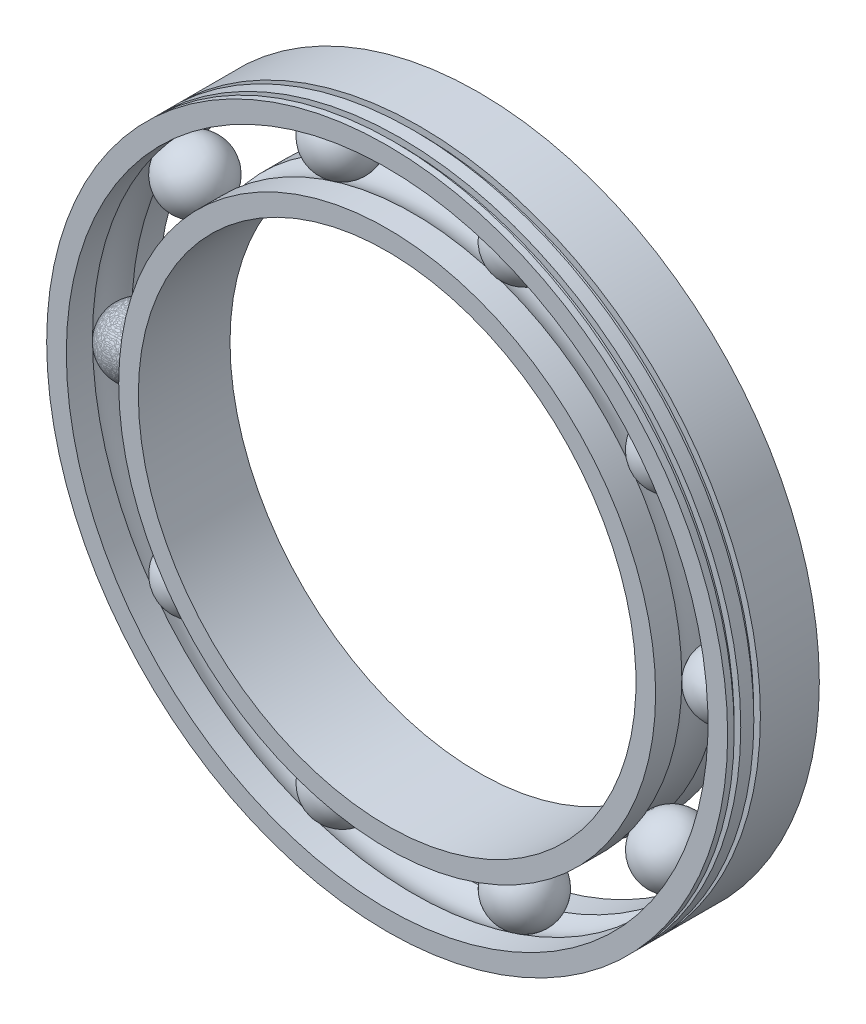
ISO-10303-21;
HEADER;
FILE_DESCRIPTION(('STEP AP214'),'2;1');
FILE_NAME('part.step','',(''),(''),'','','');
FILE_SCHEMA(('AUTOMOTIVE_DESIGN { 1 0 10303 214 1 1 1 1 }'));
ENDSEC;
DATA;
#1=APPLICATION_CONTEXT('core data for automotive mechanical design processes');
#2=APPLICATION_PROTOCOL_DEFINITION('international standard','automotive_design',2000,#1);
#3=PRODUCT_CONTEXT('',#1,'mechanical');
#4=PRODUCT('Part','Part','',(#3));
#5=PRODUCT_RELATED_PRODUCT_CATEGORY('part','',(#4));
#6=PRODUCT_DEFINITION_FORMATION('','',#4);
#7=PRODUCT_DEFINITION_CONTEXT('part definition',#1,'design');
#8=PRODUCT_DEFINITION('design','',#6,#7);
#9=PRODUCT_DEFINITION_SHAPE('','',#8);
#10=(LENGTH_UNIT() NAMED_UNIT(*) SI_UNIT(.MILLI.,.METRE.));
#11=(NAMED_UNIT(*) PLANE_ANGLE_UNIT() SI_UNIT($,.RADIAN.));
#12=(NAMED_UNIT(*) SI_UNIT($,.STERADIAN.) SOLID_ANGLE_UNIT());
#13=UNCERTAINTY_MEASURE_WITH_UNIT(LENGTH_MEASURE(1.E-05),#10,'distance_accuracy_value','');
#14=(GEOMETRIC_REPRESENTATION_CONTEXT(3) GLOBAL_UNCERTAINTY_ASSIGNED_CONTEXT((#13)) GLOBAL_UNIT_ASSIGNED_CONTEXT((#10,
#11,#12)) REPRESENTATION_CONTEXT('',''));
#15=CARTESIAN_POINT('',(0.,0.,0.));
#16=DIRECTION('',(0.,0.,1.));
#17=DIRECTION('',(1.,0.,0.));
#18=AXIS2_PLACEMENT_3D('',#15,#16,#17);
#19=CARTESIAN_POINT('',(-36.405764746873,-26.4503363531608,0.));
#20=DIRECTION('',(0.47552825814757,-0.654508497187483,0.587785252292469));
#21=DIRECTION('',(0.809016994374955,0.587785252292462,0.));
#22=AXIS2_PLACEMENT_3D('',#19,#20,#21);
#23=SPHERICAL_SURFACE('',#22,5.);
#24=CARTESIAN_POINT('',(-34.0281234561351,-29.7228788390982,2.93892626146234));
#25=VERTEX_POINT('',#24);
#26=VERTEX_LOOP('',#25);
#27=FACE_BOUND('',#26,.T.);
#28=ADVANCED_FACE('F39',(#27),#23,.T.);
#29=CLOSED_SHELL('',(#28));
#30=MANIFOLD_SOLID_BREP('B2',#29);
#31=CARTESIAN_POINT('',(-13.9057647468731,-42.7975432332818,0.));
#32=DIRECTION('',(0.769420884293814,-0.25000000000001,0.587785252292469));
#33=DIRECTION('',(0.309016994374958,0.95105651629515,0.));
#34=AXIS2_PLACEMENT_3D('',#31,#32,#33);
#35=SPHERICAL_SURFACE('',#34,5.);
#36=CARTESIAN_POINT('',(-10.0586603254041,-44.0475432332818,2.93892626146234));
#37=VERTEX_POINT('',#36);
#38=VERTEX_LOOP('',#37);
#39=FACE_BOUND('',#38,.T.);
#40=ADVANCED_FACE('F57',(#39),#35,.T.);
#41=CLOSED_SHELL('',(#40));
#42=MANIFOLD_SOLID_BREP('B6',#41);
#43=CARTESIAN_POINT('',(13.9057647468722,-42.797543233282,0.));
#44=DIRECTION('',(0.769420884293819,0.249999999999993,0.587785252292469));
#45=DIRECTION('',(-0.309016994374938,0.951056516295157,0.));
#46=AXIS2_PLACEMENT_3D('',#43,#44,#45);
#47=SPHERICAL_SURFACE('',#46,5.);
#48=CARTESIAN_POINT('',(17.7528691683413,-41.5475432332821,2.93892626146234));
#49=VERTEX_POINT('',#48);
#50=VERTEX_LOOP('',#49);
#51=FACE_BOUND('',#50,.T.);
#52=ADVANCED_FACE('F75',(#51),#47,.T.);
#53=CLOSED_SHELL('',(#52));
#54=MANIFOLD_SOLID_BREP('B35',#53);
#55=CARTESIAN_POINT('',(36.4057647468724,-26.4503363531616,0.));
#56=DIRECTION('',(0.475528258147585,0.654508497187472,0.587785252292469));
#57=DIRECTION('',(-0.809016994374942,0.58778525229248,0.));
#58=AXIS2_PLACEMENT_3D('',#55,#56,#57);
#59=SPHERICAL_SURFACE('',#58,5.);
#60=CARTESIAN_POINT('',(38.7834060376103,-23.1777938672242,2.93892626146234));
#61=VERTEX_POINT('',#60);
#62=VERTEX_LOOP('',#61);
#63=FACE_BOUND('',#62,.T.);
#64=ADVANCED_FACE('F93',(#63),#59,.T.);
#65=CLOSED_SHELL('',(#64));
#66=MANIFOLD_SOLID_BREP('B53',#65);
#67=CARTESIAN_POINT('',(45.,0.,0.));
#68=DIRECTION('',(0.,0.809016994374951,0.587785252292469));
#69=DIRECTION('',(-1.,0.,0.));
#70=AXIS2_PLACEMENT_3D('',#67,#68,#69);
#71=SPHERICAL_SURFACE('',#70,5.);
#72=CARTESIAN_POINT('',(45.,4.04508497187475,2.93892626146234));
#73=VERTEX_POINT('',#72);
#74=VERTEX_LOOP('',#73);
#75=FACE_BOUND('',#74,.T.);
#76=ADVANCED_FACE('F111',(#75),#71,.T.);
#77=CLOSED_SHELL('',(#76));
#78=MANIFOLD_SOLID_BREP('B71',#77);
#79=CARTESIAN_POINT('',(36.4057647468728,26.4503363531611,0.));
#80=DIRECTION('',(-0.475528258147575,0.654508497187479,0.587785252292469));
#81=DIRECTION('',(-0.809016994374951,-0.587785252292468,0.));
#82=AXIS2_PLACEMENT_3D('',#79,#80,#81);
#83=SPHERICAL_SURFACE('',#82,5.);
#84=CARTESIAN_POINT('',(34.0281234561349,29.7228788390985,2.93892626146234));
#85=VERTEX_POINT('',#84);
#86=VERTEX_LOOP('',#85);
#87=FACE_BOUND('',#86,.T.);
#88=ADVANCED_FACE('F129',(#87),#83,.T.);
#89=CLOSED_SHELL('',(#88));
#90=MANIFOLD_SOLID_BREP('B89',#89);
#91=CARTESIAN_POINT('',(13.9057647468728,42.7975432332819,0.));
#92=DIRECTION('',(-0.769420884293815,0.250000000000005,0.587785252292469));
#93=DIRECTION('',(-0.309016994374952,-0.951056516295152,0.));
#94=AXIS2_PLACEMENT_3D('',#91,#92,#93);
#95=SPHERICAL_SURFACE('',#94,5.);
#96=CARTESIAN_POINT('',(10.0586603254037,44.0475432332819,2.93892626146234));
#97=VERTEX_POINT('',#96);
#98=VERTEX_LOOP('',#97);
#99=FACE_BOUND('',#98,.T.);
#100=ADVANCED_FACE('F147',(#99),#95,.T.);
#101=CLOSED_SHELL('',(#100));
#102=MANIFOLD_SOLID_BREP('B107',#101);
#103=CARTESIAN_POINT('',(-13.9057647468725,42.797543233282,0.));
#104=DIRECTION('',(-0.769420884293817,-0.249999999999999,0.587785252292469));
#105=DIRECTION('',(0.309016994374945,-0.951056516295155,0.));
#106=AXIS2_PLACEMENT_3D('',#103,#104,#105);
#107=SPHERICAL_SURFACE('',#106,5.);
#108=CARTESIAN_POINT('',(-17.7528691683416,41.547543233282,2.93892626146234));
#109=VERTEX_POINT('',#108);
#110=VERTEX_LOOP('',#109);
#111=FACE_BOUND('',#110,.T.);
#112=ADVANCED_FACE('F165',(#111),#107,.T.);
#113=CLOSED_SHELL('',(#112));
#114=MANIFOLD_SOLID_BREP('B125',#113);
#115=CARTESIAN_POINT('',(-36.4057647468726,26.4503363531613,0.));
#116=DIRECTION('',(-0.47552825814758,-0.654508497187476,0.587785252292469));
#117=DIRECTION('',(0.809016994374947,-0.587785252292474,0.));
#118=AXIS2_PLACEMENT_3D('',#115,#116,#117);
#119=SPHERICAL_SURFACE('',#118,5.);
#120=CARTESIAN_POINT('',(-38.7834060376105,23.177793867224,2.93892626146234));
#121=VERTEX_POINT('',#120);
#122=VERTEX_LOOP('',#121);
#123=FACE_BOUND('',#122,.T.);
#124=ADVANCED_FACE('F183',(#123),#119,.T.);
#125=CLOSED_SHELL('',(#124));
#126=MANIFOLD_SOLID_BREP('B143',#125);
#127=CARTESIAN_POINT('',(-45.,0.,0.));
#128=DIRECTION('',(0.,0.809016994374955,-0.587785252292462));
#129=DIRECTION('',(1.,0.,0.));
#130=AXIS2_PLACEMENT_3D('',#127,#128,#129);
#131=SPHERICAL_SURFACE('',#130,5.);
#132=CARTESIAN_POINT('',(-45.,4.04508497187478,-2.93892626146231));
#133=VERTEX_POINT('',#132);
#134=VERTEX_LOOP('',#133);
#135=FACE_BOUND('',#134,.T.);
#136=ADVANCED_FACE('F201',(#135),#131,.T.);
#137=CLOSED_SHELL('',(#136));
#138=MANIFOLD_SOLID_BREP('B161',#137);
#139=CARTESIAN_POINT('',(-45.,0.,0.));
#140=DIRECTION('',(0.,0.309016994374958,-0.95105651629515));
#141=DIRECTION('',(1.,0.,0.));
#142=AXIS2_PLACEMENT_3D('',#139,#140,#141);
#143=SPHERICAL_SURFACE('',#142,5.);
#144=CARTESIAN_POINT('',(-45.,1.54508497187479,-4.75528258147575));
#145=VERTEX_POINT('',#144);
#146=VERTEX_LOOP('',#145);
#147=FACE_BOUND('',#146,.T.);
#148=ADVANCED_FACE('F219',(#147),#143,.T.);
#149=CLOSED_SHELL('',(#148));
#150=MANIFOLD_SOLID_BREP('B179',#149);
#151=CARTESIAN_POINT('',(-45.,0.,0.));
#152=DIRECTION('',(0.,-0.309016994374938,-0.951056516295157));
#153=DIRECTION('',(1.,0.,0.));
#154=AXIS2_PLACEMENT_3D('',#151,#152,#153);
#155=SPHERICAL_SURFACE('',#154,5.);
#156=CARTESIAN_POINT('',(-45.,-1.54508497187469,-4.75528258147578));
#157=VERTEX_POINT('',#156);
#158=VERTEX_LOOP('',#157);
#159=FACE_BOUND('',#158,.T.);
#160=ADVANCED_FACE('F237',(#159),#155,.T.);
#161=CLOSED_SHELL('',(#160));
#162=MANIFOLD_SOLID_BREP('B197',#161);
#163=CARTESIAN_POINT('',(-45.,0.,0.));
#164=DIRECTION('',(0.,-0.809016994374942,-0.58778525229248));
#165=DIRECTION('',(1.,0.,0.));
#166=AXIS2_PLACEMENT_3D('',#163,#164,#165);
#167=SPHERICAL_SURFACE('',#166,5.);
#168=CARTESIAN_POINT('',(-45.,-4.04508497187471,-2.9389262614624));
#169=VERTEX_POINT('',#168);
#170=VERTEX_LOOP('',#169);
#171=FACE_BOUND('',#170,.T.);
#172=ADVANCED_FACE('F255',(#171),#167,.T.);
#173=CLOSED_SHELL('',(#172));
#174=MANIFOLD_SOLID_BREP('B215',#173);
#175=CARTESIAN_POINT('',(-45.,0.,0.));
#176=DIRECTION('',(0.,-1.,0.));
#177=DIRECTION('',(1.,0.,0.));
#178=AXIS2_PLACEMENT_3D('',#175,#176,#177);
#179=SPHERICAL_SURFACE('',#178,5.);
#180=CARTESIAN_POINT('',(-45.,-5.,0.));
#181=VERTEX_POINT('',#180);
#182=VERTEX_LOOP('',#181);
#183=FACE_BOUND('',#182,.T.);
#184=ADVANCED_FACE('F273',(#183),#179,.T.);
#185=CLOSED_SHELL('',(#184));
#186=MANIFOLD_SOLID_BREP('B233',#185);
#187=CARTESIAN_POINT('',(-45.,0.,0.));
#188=DIRECTION('',(0.,-0.809016994374951,0.587785252292469));
#189=DIRECTION('',(1.,0.,0.));
#190=AXIS2_PLACEMENT_3D('',#187,#188,#189);
#191=SPHERICAL_SURFACE('',#190,5.);
#192=CARTESIAN_POINT('',(-45.,-4.04508497187475,2.93892626146234));
#193=VERTEX_POINT('',#192);
#194=VERTEX_LOOP('',#193);
#195=FACE_BOUND('',#194,.T.);
#196=ADVANCED_FACE('F291',(#195),#191,.T.);
#197=CLOSED_SHELL('',(#196));
#198=MANIFOLD_SOLID_BREP('B251',#197);
#199=CARTESIAN_POINT('',(-45.,0.,0.));
#200=DIRECTION('',(0.,-0.309016994374952,0.951056516295152));
#201=DIRECTION('',(1.,0.,0.));
#202=AXIS2_PLACEMENT_3D('',#199,#200,#201);
#203=SPHERICAL_SURFACE('',#202,5.);
#204=CARTESIAN_POINT('',(-45.,-1.54508497187476,4.75528258147576));
#205=VERTEX_POINT('',#204);
#206=VERTEX_LOOP('',#205);
#207=FACE_BOUND('',#206,.T.);
#208=ADVANCED_FACE('F309',(#207),#203,.T.);
#209=CLOSED_SHELL('',(#208));
#210=MANIFOLD_SOLID_BREP('B269',#209);
#211=CARTESIAN_POINT('',(-45.,0.,0.));
#212=DIRECTION('',(0.,0.309016994374945,0.951056516295155));
#213=DIRECTION('',(1.,0.,0.));
#214=AXIS2_PLACEMENT_3D('',#211,#212,#213);
#215=SPHERICAL_SURFACE('',#214,5.);
#216=CARTESIAN_POINT('',(-45.,1.54508497187472,4.75528258147577));
#217=VERTEX_POINT('',#216);
#218=VERTEX_LOOP('',#217);
#219=FACE_BOUND('',#218,.T.);
#220=ADVANCED_FACE('F327',(#219),#215,.T.);
#221=CLOSED_SHELL('',(#220));
#222=MANIFOLD_SOLID_BREP('B287',#221);
#223=CARTESIAN_POINT('',(-45.,0.,0.));
#224=DIRECTION('',(0.,0.809016994374947,0.587785252292474));
#225=DIRECTION('',(1.,0.,0.));
#226=AXIS2_PLACEMENT_3D('',#223,#224,#225);
#227=SPHERICAL_SURFACE('',#226,5.);
#228=CARTESIAN_POINT('',(-45.,4.04508497187473,2.93892626146237));
#229=VERTEX_POINT('',#228);
#230=VERTEX_LOOP('',#229);
#231=FACE_BOUND('',#230,.T.);
#232=ADVANCED_FACE('F345',(#231),#227,.T.);
#233=CLOSED_SHELL('',(#232));
#234=MANIFOLD_SOLID_BREP('B305',#233);
#235=CARTESIAN_POINT('',(-45.,0.,0.));
#236=DIRECTION('',(0.,1.,0.));
#237=DIRECTION('',(1.,0.,0.));
#238=AXIS2_PLACEMENT_3D('',#235,#236,#237);
#239=SPHERICAL_SURFACE('',#238,5.);
#240=CARTESIAN_POINT('',(-45.,5.,0.));
#241=VERTEX_POINT('',#240);
#242=VERTEX_LOOP('',#241);
#243=FACE_BOUND('',#242,.T.);
#244=ADVANCED_FACE('F365',(#243),#239,.T.);
#245=CLOSED_SHELL('',(#244));
#246=MANIFOLD_SOLID_BREP('B323',#245);
#247=CARTESIAN_POINT('',(-41.0424127225563,0.,7.));
#248=DIRECTION('',(0.,0.,-1.));
#249=DIRECTION('',(-1.,0.,0.));
#250=AXIS2_PLACEMENT_3D('',#247,#248,#249);
#251=PLANE('',#250);
#252=CARTESIAN_POINT('',(-0.0424127225563398,0.,7.));
#253=DIRECTION('',(0.,0.,-1.));
#254=DIRECTION('',(-1.,0.,0.));
#255=AXIS2_PLACEMENT_3D('',#252,#253,#254);
#256=CIRCLE('',#255,41.);
#257=CARTESIAN_POINT('',(-41.0424127225563,0.,7.));
#258=VERTEX_POINT('',#257);
#259=EDGE_CURVE('E364',#258,#258,#256,.T.);
#260=ORIENTED_EDGE('',*,*,#259,.F.);
#261=EDGE_LOOP('',(#260));
#262=FACE_BOUND('',#261,.T.);
#263=CARTESIAN_POINT('',(-0.0424127225563398,0.,7.));
#264=DIRECTION('',(0.,0.,-1.));
#265=DIRECTION('',(-1.,0.,0.));
#266=AXIS2_PLACEMENT_3D('',#263,#264,#265);
#267=CIRCLE('',#266,38.);
#268=CARTESIAN_POINT('',(-38.0424127225563,0.,7.));
#269=VERTEX_POINT('',#268);
#270=EDGE_CURVE('E406',#269,#269,#267,.T.);
#271=ORIENTED_EDGE('',*,*,#270,.T.);
#272=EDGE_LOOP('',(#271));
#273=FACE_BOUND('',#272,.T.);
#274=ADVANCED_FACE('F384',(#262,#273),#251,.F.);
#275=CARTESIAN_POINT('',(-0.0424127225563398,0.,-20.5155244832141));
#276=DIRECTION('',(0.,0.,-1.));
#277=DIRECTION('',(-1.,0.,0.));
#278=AXIS2_PLACEMENT_3D('',#275,#276,#277);
#279=CYLINDRICAL_SURFACE('',#278,41.);
#280=CARTESIAN_POINT('',(-0.0424127225563398,0.,2.99999999999999));
#281=DIRECTION('',(0.,0.,-1.));
#282=DIRECTION('',(-1.,0.,0.));
#283=AXIS2_PLACEMENT_3D('',#280,#281,#282);
#284=CIRCLE('',#283,41.);
#285=CARTESIAN_POINT('',(-41.0424127225563,0.,2.99999999999999));
#286=VERTEX_POINT('',#285);
#287=EDGE_CURVE('E390',#286,#286,#284,.T.);
#288=ORIENTED_EDGE('',*,*,#287,.F.);
#289=EDGE_LOOP('',(#288));
#290=FACE_BOUND('',#289,.T.);
#291=ORIENTED_EDGE('',*,*,#259,.T.);
#292=EDGE_LOOP('',(#291));
#293=FACE_BOUND('',#292,.T.);
#294=ADVANCED_FACE('F431',(#290,#293),#279,.T.);
#295=CARTESIAN_POINT('',(-0.0424127225563398,0.,0.));
#296=DIRECTION('',(0.,0.,-1.));
#297=DIRECTION('',(-1.,0.,0.));
#298=AXIS2_PLACEMENT_3D('',#295,#296,#297);
#299=TOROIDAL_SURFACE('',#298,45.,5.);
#300=CARTESIAN_POINT('',(-0.0424127225563398,0.,-2.99999999999999));
#301=DIRECTION('',(0.,0.,-1.));
#302=DIRECTION('',(-1.,0.,0.));
#303=AXIS2_PLACEMENT_3D('',#300,#301,#302);
#304=CIRCLE('',#303,41.);
#305=CARTESIAN_POINT('',(-41.0424127225563,0.,-2.99999999999999));
#306=VERTEX_POINT('',#305);
#307=EDGE_CURVE('E394',#306,#306,#304,.T.);
#308=ORIENTED_EDGE('',*,*,#307,.F.);
#309=EDGE_LOOP('',(#308));
#310=FACE_BOUND('',#309,.T.);
#311=ORIENTED_EDGE('',*,*,#287,.T.);
#312=EDGE_LOOP('',(#311));
#313=FACE_BOUND('',#312,.T.);
#314=ADVANCED_FACE('F426',(#310,#313),#299,.F.);
#315=CARTESIAN_POINT('',(-0.0424127225563398,0.,-20.5155244832141));
#316=DIRECTION('',(0.,0.,-1.));
#317=DIRECTION('',(-1.,0.,0.));
#318=AXIS2_PLACEMENT_3D('',#315,#316,#317);
#319=CYLINDRICAL_SURFACE('',#318,41.);
#320=CARTESIAN_POINT('',(-0.0424127225563398,0.,-7.));
#321=DIRECTION('',(0.,0.,-1.));
#322=DIRECTION('',(-1.,0.,0.));
#323=AXIS2_PLACEMENT_3D('',#320,#321,#322);
#324=CIRCLE('',#323,41.);
#325=CARTESIAN_POINT('',(-41.0424127225563,0.,-7.));
#326=VERTEX_POINT('',#325);
#327=EDGE_CURVE('E398',#326,#326,#324,.T.);
#328=ORIENTED_EDGE('',*,*,#327,.F.);
#329=EDGE_LOOP('',(#328));
#330=FACE_BOUND('',#329,.T.);
#331=ORIENTED_EDGE('',*,*,#307,.T.);
#332=EDGE_LOOP('',(#331));
#333=FACE_BOUND('',#332,.T.);
#334=ADVANCED_FACE('F420',(#330,#333),#319,.T.);
#335=CARTESIAN_POINT('',(-41.0424127225563,0.,-7.));
#336=DIRECTION('',(0.,0.,1.));
#337=DIRECTION('',(1.,0.,0.));
#338=AXIS2_PLACEMENT_3D('',#335,#336,#337);
#339=PLANE('',#338);
#340=CARTESIAN_POINT('',(-0.0424127225563398,0.,-7.));
#341=DIRECTION('',(0.,0.,-1.));
#342=DIRECTION('',(-1.,0.,0.));
#343=AXIS2_PLACEMENT_3D('',#340,#341,#342);
#344=CIRCLE('',#343,38.);
#345=CARTESIAN_POINT('',(-38.0424127225563,0.,-7.));
#346=VERTEX_POINT('',#345);
#347=EDGE_CURVE('E403',#346,#346,#344,.T.);
#348=ORIENTED_EDGE('',*,*,#347,.F.);
#349=EDGE_LOOP('',(#348));
#350=FACE_BOUND('',#349,.T.);
#351=ORIENTED_EDGE('',*,*,#327,.T.);
#352=EDGE_LOOP('',(#351));
#353=FACE_BOUND('',#352,.T.);
#354=ADVANCED_FACE('F414',(#350,#353),#339,.F.);
#355=CARTESIAN_POINT('',(-0.0424127225563398,0.,-20.5155244832141));
#356=DIRECTION('',(0.,0.,-1.));
#357=DIRECTION('',(-1.,0.,0.));
#358=AXIS2_PLACEMENT_3D('',#355,#356,#357);
#359=CYLINDRICAL_SURFACE('',#358,38.);
#360=ORIENTED_EDGE('',*,*,#270,.F.);
#361=EDGE_LOOP('',(#360));
#362=FACE_BOUND('',#361,.T.);
#363=ORIENTED_EDGE('',*,*,#347,.T.);
#364=EDGE_LOOP('',(#363));
#365=FACE_BOUND('',#364,.T.);
#366=ADVANCED_FACE('F411',(#362,#365),#359,.F.);
#367=CLOSED_SHELL('',(#274,#294,#314,#334,#354,#366));
#368=MANIFOLD_SOLID_BREP('B341',#367);
#369=CARTESIAN_POINT('',(-0.0424127225563398,0.,0.));
#370=DIRECTION('',(0.,0.,-1.));
#371=DIRECTION('',(-1.,0.,0.));
#372=AXIS2_PLACEMENT_3D('',#369,#370,#371);
#373=TOROIDAL_SURFACE('',#372,45.,5.);
#374=CARTESIAN_POINT('',(-0.0424127225563398,0.,2.99999999999998));
#375=DIRECTION('',(0.,0.,-1.));
#376=DIRECTION('',(-1.,0.,0.));
#377=AXIS2_PLACEMENT_3D('',#374,#375,#376);
#378=CIRCLE('',#377,49.);
#379=CARTESIAN_POINT('',(-49.0424127225563,0.,2.99999999999998));
#380=VERTEX_POINT('',#379);
#381=EDGE_CURVE('E383',#380,#380,#378,.T.);
#382=ORIENTED_EDGE('',*,*,#381,.F.);
#383=EDGE_LOOP('',(#382));
#384=FACE_BOUND('',#383,.T.);
#385=CARTESIAN_POINT('',(-0.0424127225563398,0.,-2.99999999999998));
#386=DIRECTION('',(0.,0.,-1.));
#387=DIRECTION('',(-1.,0.,0.));
#388=AXIS2_PLACEMENT_3D('',#385,#386,#387);
#389=CIRCLE('',#388,49.);
#390=CARTESIAN_POINT('',(-49.0424127225563,0.,-2.99999999999998));
#391=VERTEX_POINT('',#390);
#392=EDGE_CURVE('E521',#391,#391,#389,.T.);
#393=ORIENTED_EDGE('',*,*,#392,.T.);
#394=EDGE_LOOP('',(#393));
#395=FACE_BOUND('',#394,.T.);
#396=ADVANCED_FACE('F475',(#384,#395),#373,.F.);
#397=CARTESIAN_POINT('',(-0.0424127225563398,0.,-20.5155244832141));
#398=DIRECTION('',(0.,0.,-1.));
#399=DIRECTION('',(-1.,0.,0.));
#400=AXIS2_PLACEMENT_3D('',#397,#398,#399);
#401=CYLINDRICAL_SURFACE('',#400,49.);
#402=CARTESIAN_POINT('',(-0.0424127225563398,0.,7.));
#403=DIRECTION('',(0.,0.,-1.));
#404=DIRECTION('',(-1.,0.,0.));
#405=AXIS2_PLACEMENT_3D('',#402,#403,#404);
#406=CIRCLE('',#405,49.);
#407=CARTESIAN_POINT('',(-49.0424127225563,0.,7.));
#408=VERTEX_POINT('',#407);
#409=EDGE_CURVE('E481',#408,#408,#406,.T.);
#410=ORIENTED_EDGE('',*,*,#409,.F.);
#411=EDGE_LOOP('',(#410));
#412=FACE_BOUND('',#411,.T.);
#413=ORIENTED_EDGE('',*,*,#381,.T.);
#414=EDGE_LOOP('',(#413));
#415=FACE_BOUND('',#414,.T.);
#416=ADVANCED_FACE('F594',(#412,#415),#401,.F.);
#417=CARTESIAN_POINT('',(-52.0424127225563,0.,7.));
#418=DIRECTION('',(0.,0.,-1.));
#419=DIRECTION('',(-1.,0.,0.));
#420=AXIS2_PLACEMENT_3D('',#417,#418,#419);
#421=PLANE('',#420);
#422=CARTESIAN_POINT('',(-0.0424127225563398,0.,7.));
#423=DIRECTION('',(0.,0.,-1.));
#424=DIRECTION('',(-1.,0.,0.));
#425=AXIS2_PLACEMENT_3D('',#422,#423,#424);
#426=CIRCLE('',#425,52.);
#427=CARTESIAN_POINT('',(-52.0424127225563,0.,7.));
#428=VERTEX_POINT('',#427);
#429=EDGE_CURVE('E485',#428,#428,#426,.T.);
#430=ORIENTED_EDGE('',*,*,#429,.F.);
#431=EDGE_LOOP('',(#430));
#432=FACE_BOUND('',#431,.T.);
#433=ORIENTED_EDGE('',*,*,#409,.T.);
#434=EDGE_LOOP('',(#433));
#435=FACE_BOUND('',#434,.T.);
#436=ADVANCED_FACE('F589',(#432,#435),#421,.F.);
#437=CARTESIAN_POINT('',(-0.0424127225563398,0.,-20.5155244832141));
#438=DIRECTION('',(0.,0.,-1.));
#439=DIRECTION('',(-1.,0.,0.));
#440=AXIS2_PLACEMENT_3D('',#437,#438,#439);
#441=CYLINDRICAL_SURFACE('',#440,52.);
#442=CARTESIAN_POINT('',(-0.0424127225563398,0.,6.));
#443=DIRECTION('',(0.,0.,-1.));
#444=DIRECTION('',(-1.,0.,0.));
#445=AXIS2_PLACEMENT_3D('',#442,#443,#444);
#446=CIRCLE('',#445,52.);
#447=CARTESIAN_POINT('',(-52.0424127225563,0.,6.));
#448=VERTEX_POINT('',#447);
#449=EDGE_CURVE('E489',#448,#448,#446,.T.);
#450=ORIENTED_EDGE('',*,*,#449,.F.);
#451=EDGE_LOOP('',(#450));
#452=FACE_BOUND('',#451,.T.);
#453=ORIENTED_EDGE('',*,*,#429,.T.);
#454=EDGE_LOOP('',(#453));
#455=FACE_BOUND('',#454,.T.);
#456=ADVANCED_FACE('F583',(#452,#455),#441,.T.);
#457=CARTESIAN_POINT('',(-52.0424127225563,0.,6.));
#458=DIRECTION('',(0.,0.,1.));
#459=DIRECTION('',(1.,0.,0.));
#460=AXIS2_PLACEMENT_3D('',#457,#458,#459);
#461=PLANE('',#460);
#462=CARTESIAN_POINT('',(-0.0424127225563398,0.,6.));
#463=DIRECTION('',(0.,0.,-1.));
#464=DIRECTION('',(-1.,0.,0.));
#465=AXIS2_PLACEMENT_3D('',#462,#463,#464);
#466=CIRCLE('',#465,51.);
#467=CARTESIAN_POINT('',(-51.0424127225563,0.,6.));
#468=VERTEX_POINT('',#467);
#469=EDGE_CURVE('E494',#468,#468,#466,.T.);
#470=ORIENTED_EDGE('',*,*,#469,.F.);
#471=EDGE_LOOP('',(#470));
#472=FACE_BOUND('',#471,.T.);
#473=ORIENTED_EDGE('',*,*,#449,.T.);
#474=EDGE_LOOP('',(#473));
#475=FACE_BOUND('',#474,.T.);
#476=ADVANCED_FACE('F577',(#472,#475),#461,.F.);
#477=CARTESIAN_POINT('',(-0.0424127225563398,0.,-20.5155244832141));
#478=DIRECTION('',(0.,0.,-1.));
#479=DIRECTION('',(-1.,0.,0.));
#480=AXIS2_PLACEMENT_3D('',#477,#478,#479);
#481=CYLINDRICAL_SURFACE('',#480,51.);
#482=CARTESIAN_POINT('',(-0.0424127225563398,0.,5.));
#483=DIRECTION('',(0.,0.,-1.));
#484=DIRECTION('',(-1.,0.,0.));
#485=AXIS2_PLACEMENT_3D('',#482,#483,#484);
#486=CIRCLE('',#485,51.);
#487=CARTESIAN_POINT('',(-51.0424127225563,0.,5.));
#488=VERTEX_POINT('',#487);
#489=EDGE_CURVE('E497',#488,#488,#486,.T.);
#490=ORIENTED_EDGE('',*,*,#489,.F.);
#491=EDGE_LOOP('',(#490));
#492=FACE_BOUND('',#491,.T.);
#493=ORIENTED_EDGE('',*,*,#469,.T.);
#494=EDGE_LOOP('',(#493));
#495=FACE_BOUND('',#494,.T.);
#496=ADVANCED_FACE('F571',(#492,#495),#481,.T.);
#497=CARTESIAN_POINT('',(-51.0424127225563,0.,5.));
#498=DIRECTION('',(0.,0.,-1.));
#499=DIRECTION('',(-1.,0.,0.));
#500=AXIS2_PLACEMENT_3D('',#497,#498,#499);
#501=PLANE('',#500);
#502=CARTESIAN_POINT('',(-0.0424127225563398,0.,5.));
#503=DIRECTION('',(0.,0.,-1.));
#504=DIRECTION('',(-1.,0.,0.));
#505=AXIS2_PLACEMENT_3D('',#502,#503,#504);
#506=CIRCLE('',#505,52.);
#507=CARTESIAN_POINT('',(-52.0424127225563,0.,5.));
#508=VERTEX_POINT('',#507);
#509=EDGE_CURVE('E500',#508,#508,#506,.T.);
#510=ORIENTED_EDGE('',*,*,#509,.F.);
#511=EDGE_LOOP('',(#510));
#512=FACE_BOUND('',#511,.T.);
#513=ORIENTED_EDGE('',*,*,#489,.T.);
#514=EDGE_LOOP('',(#513));
#515=FACE_BOUND('',#514,.T.);
#516=ADVANCED_FACE('F565',(#512,#515),#501,.F.);
#517=CARTESIAN_POINT('',(-0.0424127225563398,0.,-20.5155244832141));
#518=DIRECTION('',(0.,0.,-1.));
#519=DIRECTION('',(-1.,0.,0.));
#520=AXIS2_PLACEMENT_3D('',#517,#518,#519);
#521=CYLINDRICAL_SURFACE('',#520,52.);
#522=CARTESIAN_POINT('',(-0.0424127225563398,0.,3.));
#523=DIRECTION('',(0.,0.,-1.));
#524=DIRECTION('',(-1.,0.,0.));
#525=AXIS2_PLACEMENT_3D('',#522,#523,#524);
#526=CIRCLE('',#525,52.);
#527=CARTESIAN_POINT('',(-52.0424127225563,0.,3.));
#528=VERTEX_POINT('',#527);
#529=EDGE_CURVE('E503',#528,#528,#526,.T.);
#530=ORIENTED_EDGE('',*,*,#529,.F.);
#531=EDGE_LOOP('',(#530));
#532=FACE_BOUND('',#531,.T.);
#533=ORIENTED_EDGE('',*,*,#509,.T.);
#534=EDGE_LOOP('',(#533));
#535=FACE_BOUND('',#534,.T.);
#536=ADVANCED_FACE('F559',(#532,#535),#521,.T.);
#537=CARTESIAN_POINT('',(-52.0424127225563,0.,3.));
#538=DIRECTION('',(0.,0.,1.));
#539=DIRECTION('',(1.,0.,0.));
#540=AXIS2_PLACEMENT_3D('',#537,#538,#539);
#541=PLANE('',#540);
#542=CARTESIAN_POINT('',(-0.0424127225563398,0.,3.));
#543=DIRECTION('',(0.,0.,-1.));
#544=DIRECTION('',(-1.,0.,0.));
#545=AXIS2_PLACEMENT_3D('',#542,#543,#544);
#546=CIRCLE('',#545,51.);
#547=CARTESIAN_POINT('',(-51.0424127225563,0.,3.));
#548=VERTEX_POINT('',#547);
#549=EDGE_CURVE('E506',#548,#548,#546,.T.);
#550=ORIENTED_EDGE('',*,*,#549,.F.);
#551=EDGE_LOOP('',(#550));
#552=FACE_BOUND('',#551,.T.);
#553=ORIENTED_EDGE('',*,*,#529,.T.);
#554=EDGE_LOOP('',(#553));
#555=FACE_BOUND('',#554,.T.);
#556=ADVANCED_FACE('F553',(#552,#555),#541,.F.);
#557=CARTESIAN_POINT('',(-0.0424127225563398,0.,-20.5155244832141));
#558=DIRECTION('',(0.,0.,-1.));
#559=DIRECTION('',(-1.,0.,0.));
#560=AXIS2_PLACEMENT_3D('',#557,#558,#559);
#561=CYLINDRICAL_SURFACE('',#560,51.);
#562=CARTESIAN_POINT('',(-0.0424127225563398,0.,2.));
#563=DIRECTION('',(0.,0.,-1.));
#564=DIRECTION('',(-1.,0.,0.));
#565=AXIS2_PLACEMENT_3D('',#562,#563,#564);
#566=CIRCLE('',#565,51.);
#567=CARTESIAN_POINT('',(-51.0424127225563,0.,2.));
#568=VERTEX_POINT('',#567);
#569=EDGE_CURVE('E509',#568,#568,#566,.T.);
#570=ORIENTED_EDGE('',*,*,#569,.F.);
#571=EDGE_LOOP('',(#570));
#572=FACE_BOUND('',#571,.T.);
#573=ORIENTED_EDGE('',*,*,#549,.T.);
#574=EDGE_LOOP('',(#573));
#575=FACE_BOUND('',#574,.T.);
#576=ADVANCED_FACE('F547',(#572,#575),#561,.T.);
#577=CARTESIAN_POINT('',(-51.0424127225563,0.,2.));
#578=DIRECTION('',(0.,0.,-1.));
#579=DIRECTION('',(-1.,0.,0.));
#580=AXIS2_PLACEMENT_3D('',#577,#578,#579);
#581=PLANE('',#580);
#582=CARTESIAN_POINT('',(-0.0424127225563398,0.,2.));
#583=DIRECTION('',(0.,0.,-1.));
#584=DIRECTION('',(-1.,0.,0.));
#585=AXIS2_PLACEMENT_3D('',#582,#583,#584);
#586=CIRCLE('',#585,52.);
#587=CARTESIAN_POINT('',(-52.0424127225563,0.,2.));
#588=VERTEX_POINT('',#587);
#589=EDGE_CURVE('E512',#588,#588,#586,.T.);
#590=ORIENTED_EDGE('',*,*,#589,.F.);
#591=EDGE_LOOP('',(#590));
#592=FACE_BOUND('',#591,.T.);
#593=ORIENTED_EDGE('',*,*,#569,.T.);
#594=EDGE_LOOP('',(#593));
#595=FACE_BOUND('',#594,.T.);
#596=ADVANCED_FACE('F541',(#592,#595),#581,.F.);
#597=CARTESIAN_POINT('',(-0.0424127225563398,0.,-20.5155244832141));
#598=DIRECTION('',(0.,0.,-1.));
#599=DIRECTION('',(-1.,0.,0.));
#600=AXIS2_PLACEMENT_3D('',#597,#598,#599);
#601=CYLINDRICAL_SURFACE('',#600,52.);
#602=CARTESIAN_POINT('',(-0.0424127225563398,0.,-7.));
#603=DIRECTION('',(0.,0.,-1.));
#604=DIRECTION('',(-1.,0.,0.));
#605=AXIS2_PLACEMENT_3D('',#602,#603,#604);
#606=CIRCLE('',#605,52.);
#607=CARTESIAN_POINT('',(-52.0424127225563,0.,-7.));
#608=VERTEX_POINT('',#607);
#609=EDGE_CURVE('E515',#608,#608,#606,.T.);
#610=ORIENTED_EDGE('',*,*,#609,.F.);
#611=EDGE_LOOP('',(#610));
#612=FACE_BOUND('',#611,.T.);
#613=ORIENTED_EDGE('',*,*,#589,.T.);
#614=EDGE_LOOP('',(#613));
#615=FACE_BOUND('',#614,.T.);
#616=ADVANCED_FACE('F535',(#612,#615),#601,.T.);
#617=CARTESIAN_POINT('',(-52.0424127225563,0.,-7.));
#618=DIRECTION('',(0.,0.,1.));
#619=DIRECTION('',(1.,0.,0.));
#620=AXIS2_PLACEMENT_3D('',#617,#618,#619);
#621=PLANE('',#620);
#622=CARTESIAN_POINT('',(-0.0424127225563398,0.,-7.));
#623=DIRECTION('',(0.,0.,-1.));
#624=DIRECTION('',(-1.,0.,0.));
#625=AXIS2_PLACEMENT_3D('',#622,#623,#624);
#626=CIRCLE('',#625,49.);
#627=CARTESIAN_POINT('',(-49.0424127225563,0.,-7.));
#628=VERTEX_POINT('',#627);
#629=EDGE_CURVE('E518',#628,#628,#626,.T.);
#630=ORIENTED_EDGE('',*,*,#629,.F.);
#631=EDGE_LOOP('',(#630));
#632=FACE_BOUND('',#631,.T.);
#633=ORIENTED_EDGE('',*,*,#609,.T.);
#634=EDGE_LOOP('',(#633));
#635=FACE_BOUND('',#634,.T.);
#636=ADVANCED_FACE('F529',(#632,#635),#621,.F.);
#637=CARTESIAN_POINT('',(-0.0424127225563398,0.,-20.5155244832141));
#638=DIRECTION('',(0.,0.,-1.));
#639=DIRECTION('',(-1.,0.,0.));
#640=AXIS2_PLACEMENT_3D('',#637,#638,#639);
#641=CYLINDRICAL_SURFACE('',#640,49.);
#642=ORIENTED_EDGE('',*,*,#392,.F.);
#643=EDGE_LOOP('',(#642));
#644=FACE_BOUND('',#643,.T.);
#645=ORIENTED_EDGE('',*,*,#629,.T.);
#646=EDGE_LOOP('',(#645));
#647=FACE_BOUND('',#646,.T.);
#648=ADVANCED_FACE('F526',(#644,#647),#641,.F.);
#649=CLOSED_SHELL('',(#396,#416,#436,#456,#476,#496,#516,#536,#556,#576,#596,#616,#636,#648));
#650=MANIFOLD_SOLID_BREP('B359',#649);
#651=ADVANCED_BREP_SHAPE_REPRESENTATION('',(#18,#30,#42,#54,#66,#78,#90,#102,#114,#126,#138,
#150,#162,#174,#186,#198,#210,#222,#234,#246,#368,#650),#14);
#652=SHAPE_DEFINITION_REPRESENTATION(#9,#651);
ENDSEC;
END-ISO-10303-21;
